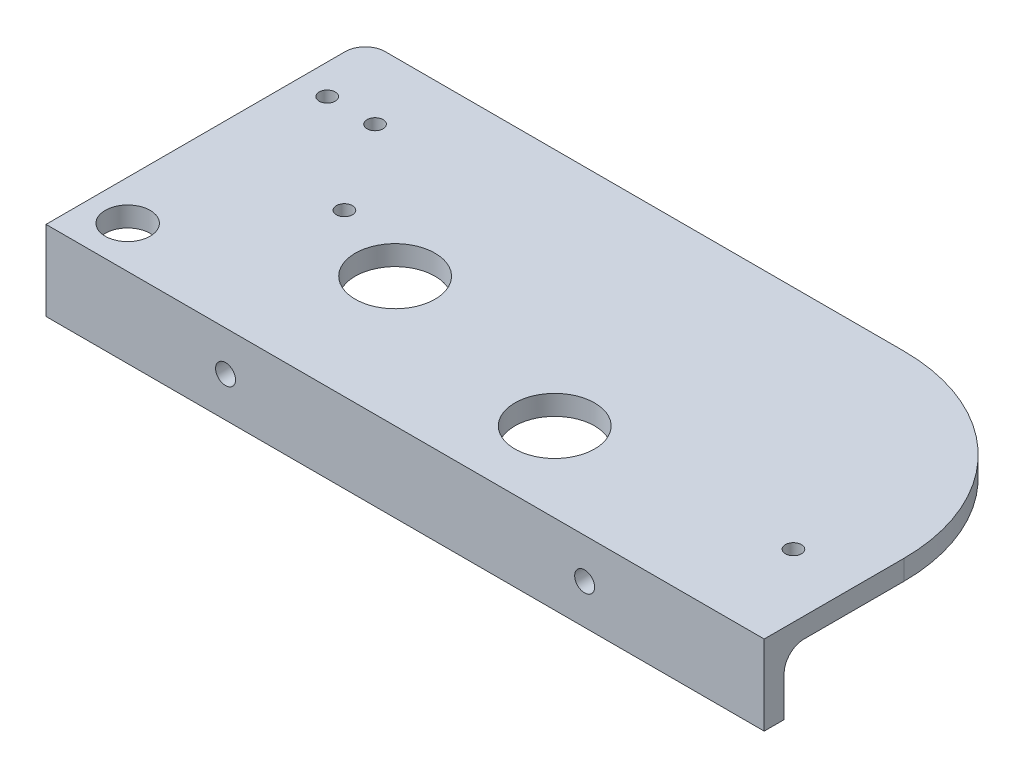
ISO-10303-21;
HEADER;
FILE_DESCRIPTION(('STEP AP214'),'2;1');
FILE_NAME('part.step','',(''),(''),'','','');
FILE_SCHEMA(('AUTOMOTIVE_DESIGN { 1 0 10303 214 1 1 1 1 }'));
ENDSEC;
DATA;
#1=APPLICATION_CONTEXT('core data for automotive mechanical design processes');
#2=APPLICATION_PROTOCOL_DEFINITION('international standard','automotive_design',2000,#1);
#3=PRODUCT_CONTEXT('',#1,'mechanical');
#4=PRODUCT('Part','Part','',(#3));
#5=PRODUCT_RELATED_PRODUCT_CATEGORY('part','',(#4));
#6=PRODUCT_DEFINITION_FORMATION('','',#4);
#7=PRODUCT_DEFINITION_CONTEXT('part definition',#1,'design');
#8=PRODUCT_DEFINITION('design','',#6,#7);
#9=PRODUCT_DEFINITION_SHAPE('','',#8);
#10=(LENGTH_UNIT() NAMED_UNIT(*) SI_UNIT(.MILLI.,.METRE.));
#11=(NAMED_UNIT(*) PLANE_ANGLE_UNIT() SI_UNIT($,.RADIAN.));
#12=(NAMED_UNIT(*) SI_UNIT($,.STERADIAN.) SOLID_ANGLE_UNIT());
#13=UNCERTAINTY_MEASURE_WITH_UNIT(LENGTH_MEASURE(1.E-05),#10,'distance_accuracy_value','');
#14=(GEOMETRIC_REPRESENTATION_CONTEXT(3) GLOBAL_UNCERTAINTY_ASSIGNED_CONTEXT((#13)) GLOBAL_UNIT_ASSIGNED_CONTEXT((#10,
#11,#12)) REPRESENTATION_CONTEXT('',''));
#15=CARTESIAN_POINT('',(0.,0.,0.));
#16=DIRECTION('',(0.,0.,1.));
#17=DIRECTION('',(1.,0.,0.));
#18=AXIS2_PLACEMENT_3D('',#15,#16,#17);
#19=CARTESIAN_POINT('',(-43.5930960469009,-19.05,45.0477144987486));
#20=DIRECTION('',(0.,0.,1.));
#21=DIRECTION('',(1.,0.,0.));
#22=AXIS2_PLACEMENT_3D('',#19,#20,#21);
#23=PLANE('',#22);
#24=DIRECTION('',(0.,1.,0.));
#25=VECTOR('',#24,1.);
#26=CARTESIAN_POINT('',(-29.2310409014925,6.35,45.0477144987486));
#27=LINE('',#26,#25);
#28=CARTESIAN_POINT('',(-29.2310409014925,-19.05,45.0477144987486));
#29=VERTEX_POINT('',#28);
#30=CARTESIAN_POINT('',(-29.2310409014925,-6.35,45.0477144987486));
#31=VERTEX_POINT('',#30);
#32=EDGE_CURVE('E165',#29,#31,#27,.T.);
#33=ORIENTED_EDGE('',*,*,#32,.T.);
#34=DIRECTION('',(1.,0.,0.));
#35=VECTOR('',#34,1.);
#36=CARTESIAN_POINT('',(185.006903953099,-6.35,45.0477144987486));
#37=LINE('',#36,#35);
#38=CARTESIAN_POINT('',(10.3819039530991,-6.35,45.0477144987486));
#39=VERTEX_POINT('',#38);
#40=EDGE_CURVE('E246',#31,#39,#37,.T.);
#41=ORIENTED_EDGE('',*,*,#40,.T.);
#42=CARTESIAN_POINT('',(13.5569039530991,-6.34999999999999,45.0477144987486));
#43=DIRECTION('',(0.,0.,1.));
#44=DIRECTION('',(1.,0.,0.));
#45=AXIS2_PLACEMENT_3D('',#42,#43,#44);
#46=CIRCLE('',#45,3.175);
#47=CARTESIAN_POINT('',(16.7319039530991,-6.35,45.0477144987486));
#48=VERTEX_POINT('',#47);
#49=EDGE_CURVE('E431',#48,#39,#46,.F.);
#50=ORIENTED_EDGE('',*,*,#49,.F.);
#51=DIRECTION('',(1.,0.,0.));
#52=VECTOR('',#51,1.);
#53=CARTESIAN_POINT('',(185.006903953099,-6.35,45.0477144987486));
#54=LINE('',#53,#52);
#55=CARTESIAN_POINT('',(124.681903953099,-6.35,45.0477144987486));
#56=VERTEX_POINT('',#55);
#57=EDGE_CURVE('E244',#48,#56,#54,.T.);
#58=ORIENTED_EDGE('',*,*,#57,.T.);
#59=CARTESIAN_POINT('',(127.856903953099,-6.34999999999998,45.0477144987486));
#60=DIRECTION('',(0.,0.,1.));
#61=DIRECTION('',(1.,0.,0.));
#62=AXIS2_PLACEMENT_3D('',#59,#60,#61);
#63=CIRCLE('',#62,3.175);
#64=CARTESIAN_POINT('',(131.031903953099,-6.35,45.0477144987486));
#65=VERTEX_POINT('',#64);
#66=EDGE_CURVE('E367',#65,#56,#63,.F.);
#67=ORIENTED_EDGE('',*,*,#66,.F.);
#68=DIRECTION('',(1.,0.,0.));
#69=VECTOR('',#68,1.);
#70=CARTESIAN_POINT('',(185.006903953099,-6.35,45.0477144987486));
#71=LINE('',#70,#69);
#72=CARTESIAN_POINT('',(185.006903953099,-6.35,45.0477144987486));
#73=VERTEX_POINT('',#72);
#74=EDGE_CURVE('E66',#65,#73,#71,.T.);
#75=ORIENTED_EDGE('',*,*,#74,.T.);
#76=DIRECTION('',(0.,1.,0.));
#77=VECTOR('',#76,1.);
#78=CARTESIAN_POINT('',(185.006903953099,-19.05,45.0477144987486));
#79=LINE('',#78,#77);
#80=CARTESIAN_POINT('',(185.006903953099,-19.05,45.0477144987486));
#81=VERTEX_POINT('',#80);
#82=EDGE_CURVE('E191',#81,#73,#79,.T.);
#83=ORIENTED_EDGE('',*,*,#82,.F.);
#84=DIRECTION('',(1.,0.,0.));
#85=VECTOR('',#84,1.);
#86=CARTESIAN_POINT('',(-43.5930960469009,-19.05,45.0477144987486));
#87=LINE('',#86,#85);
#88=EDGE_CURVE('E182',#29,#81,#87,.T.);
#89=ORIENTED_EDGE('',*,*,#88,.F.);
#90=EDGE_LOOP('',(#33,#41,#50,#58,#67,#75,#83,#89));
#91=FACE_BOUND('',#90,.T.);
#92=ADVANCED_FACE('F45',(#91),#23,.F.);
#93=CARTESIAN_POINT('',(0.,0.,0.));
#94=DIRECTION('',(0.,1.,0.));
#95=DIRECTION('',(0.,0.,1.));
#96=AXIS2_PLACEMENT_3D('',#93,#94,#95);
#97=PLANE('',#96);
#98=CARTESIAN_POINT('',(26.2569039530991,0.,10.1227144987486));
#99=DIRECTION('',(0.,-1.,0.));
#100=DIRECTION('',(0.,0.,-1.));
#101=AXIS2_PLACEMENT_3D('',#98,#99,#100);
#102=CIRCLE('',#101,12.7);
#103=CARTESIAN_POINT('',(26.2569039530991,0.,-2.5772855012514));
#104=VERTEX_POINT('',#103);
#105=EDGE_CURVE('E423',#104,#104,#102,.T.);
#106=ORIENTED_EDGE('',*,*,#105,.F.);
#107=EDGE_LOOP('',(#106));
#108=FACE_BOUND('',#107,.T.);
#109=CARTESIAN_POINT('',(-30.8930960469009,0.,38.1));
#110=DIRECTION('',(0.,1.,0.));
#111=DIRECTION('',(0.,0.,1.));
#112=AXIS2_PLACEMENT_3D('',#109,#110,#111);
#113=CIRCLE('',#112,7.14374999999999);
#114=CARTESIAN_POINT('',(-23.7743952215757,0.,38.6977144987486));
#115=VERTEX_POINT('',#114);
#116=CARTESIAN_POINT('',(-38.0117968722261,0.,38.6977144987486));
#117=VERTEX_POINT('',#116);
#118=EDGE_CURVE('E173',#115,#117,#113,.T.);
#119=ORIENTED_EDGE('',*,*,#118,.T.);
#120=DIRECTION('',(1.,0.,0.));
#121=VECTOR('',#120,1.);
#122=CARTESIAN_POINT('',(-43.5930960469009,0.,38.6977144987486));
#123=LINE('',#122,#121);
#124=CARTESIAN_POINT('',(-43.5930960469009,0.,38.6977144987486));
#125=VERTEX_POINT('',#124);
#126=EDGE_CURVE('E241',#117,#125,#123,.F.);
#127=ORIENTED_EDGE('',*,*,#126,.T.);
#128=DIRECTION('',(0.,0.,1.));
#129=VECTOR('',#128,1.);
#130=CARTESIAN_POINT('',(-43.5930960469009,0.,-50.2022855012514));
#131=LINE('',#130,#129);
#132=CARTESIAN_POINT('',(-43.5930960469009,0.,-43.8522855012514));
#133=VERTEX_POINT('',#132);
#134=EDGE_CURVE('E195',#133,#125,#131,.T.);
#135=ORIENTED_EDGE('',*,*,#134,.F.);
#136=CARTESIAN_POINT('',(-37.2430960469009,0.,-43.8522855012514));
#137=DIRECTION('',(0.,1.,0.));
#138=DIRECTION('',(0.,0.,1.));
#139=AXIS2_PLACEMENT_3D('',#136,#137,#138);
#140=CIRCLE('',#139,6.35);
#141=CARTESIAN_POINT('',(-37.2430960469009,0.,-50.2022855012514));
#142=VERTEX_POINT('',#141);
#143=EDGE_CURVE('E222',#133,#142,#140,.F.);
#144=ORIENTED_EDGE('',*,*,#143,.T.);
#145=DIRECTION('',(-1.,0.,0.));
#146=VECTOR('',#145,1.);
#147=CARTESIAN_POINT('',(-43.5930960469009,0.,-50.2022855012514));
#148=LINE('',#147,#146);
#149=CARTESIAN_POINT('',(127.856903953099,0.,-50.2022855012514));
#150=VERTEX_POINT('',#149);
#151=EDGE_CURVE('E199',#150,#142,#148,.T.);
#152=ORIENTED_EDGE('',*,*,#151,.F.);
#153=CARTESIAN_POINT('',(127.856903953099,0.,6.94771449874861));
#154=DIRECTION('',(0.,1.,0.));
#155=DIRECTION('',(0.,0.,1.));
#156=AXIS2_PLACEMENT_3D('',#153,#154,#155);
#157=CIRCLE('',#156,57.15);
#158=CARTESIAN_POINT('',(185.006903953099,0.,6.94771449874861));
#159=VERTEX_POINT('',#158);
#160=EDGE_CURVE('E224',#150,#159,#157,.F.);
#161=ORIENTED_EDGE('',*,*,#160,.T.);
#162=DIRECTION('',(0.,0.,-1.));
#163=VECTOR('',#162,1.);
#164=CARTESIAN_POINT('',(185.006903953099,0.,-50.2022855012514));
#165=LINE('',#164,#163);
#166=CARTESIAN_POINT('',(185.006903953099,0.,38.6977144987486));
#167=VERTEX_POINT('',#166);
#168=EDGE_CURVE('E210',#167,#159,#165,.T.);
#169=ORIENTED_EDGE('',*,*,#168,.F.);
#170=DIRECTION('',(1.,0.,0.));
#171=VECTOR('',#170,1.);
#172=CARTESIAN_POINT('',(-29.2310409014925,0.,38.6977144987486));
#173=LINE('',#172,#171);
#174=CARTESIAN_POINT('',(92.9319039530991,0.,38.6977144987486));
#175=VERTEX_POINT('',#174);
#176=EDGE_CURVE('E239',#167,#175,#173,.F.);
#177=ORIENTED_EDGE('',*,*,#176,.T.);
#178=CARTESIAN_POINT('',(92.9319039530991,0.,25.9977144987486));
#179=DIRECTION('',(0.,-1.,0.));
#180=DIRECTION('',(0.,0.,-1.));
#181=AXIS2_PLACEMENT_3D('',#178,#179,#180);
#182=CIRCLE('',#181,12.7);
#183=EDGE_CURVE('E418',#175,#175,#182,.T.);
#184=ORIENTED_EDGE('',*,*,#183,.F.);
#185=DIRECTION('',(1.,0.,0.));
#186=VECTOR('',#185,1.);
#187=CARTESIAN_POINT('',(-29.2310409014925,0.,38.6977144987486));
#188=LINE('',#187,#186);
#189=EDGE_CURVE('E237',#175,#115,#188,.F.);
#190=ORIENTED_EDGE('',*,*,#189,.T.);
#191=EDGE_LOOP('',(#119,#127,#135,#144,#152,#161,#169,#177,#184,#190));
#192=FACE_BOUND('',#191,.T.);
#193=CARTESIAN_POINT('',(-34.0680960469009,0.,-28.575));
#194=DIRECTION('',(0.,1.,0.));
#195=DIRECTION('',(0.,0.,1.));
#196=AXIS2_PLACEMENT_3D('',#193,#194,#195);
#197=CIRCLE('',#196,2.5527);
#198=CARTESIAN_POINT('',(-34.0680960469009,0.,-26.0223));
#199=VERTEX_POINT('',#198);
#200=EDGE_CURVE('E411',#199,#199,#197,.T.);
#201=ORIENTED_EDGE('',*,*,#200,.T.);
#202=EDGE_LOOP('',(#201));
#203=FACE_BOUND('',#202,.T.);
#204=CARTESIAN_POINT('',(-18.8280960469009,0.,-28.575));
#205=DIRECTION('',(0.,1.,0.));
#206=DIRECTION('',(0.,0.,1.));
#207=AXIS2_PLACEMENT_3D('',#204,#205,#206);
#208=CIRCLE('',#207,2.5527);
#209=CARTESIAN_POINT('',(-18.8280960469009,0.,-26.0223));
#210=VERTEX_POINT('',#209);
#211=EDGE_CURVE('E405',#210,#210,#208,.T.);
#212=ORIENTED_EDGE('',*,*,#211,.T.);
#213=EDGE_LOOP('',(#212));
#214=FACE_BOUND('',#213,.T.);
#215=CARTESIAN_POINT('',(0.,0.,0.));
#216=DIRECTION('',(0.,1.,0.));
#217=DIRECTION('',(0.,0.,1.));
#218=AXIS2_PLACEMENT_3D('',#215,#216,#217);
#219=CIRCLE('',#218,2.5527);
#220=CARTESIAN_POINT('',(0.,0.,2.5527));
#221=VERTEX_POINT('',#220);
#222=EDGE_CURVE('E397',#221,#221,#219,.T.);
#223=ORIENTED_EDGE('',*,*,#222,.T.);
#224=EDGE_LOOP('',(#223));
#225=FACE_BOUND('',#224,.T.);
#226=CARTESIAN_POINT('',(164.907701135125,0.,21.9875101453017));
#227=DIRECTION('',(0.,1.,0.));
#228=DIRECTION('',(0.,0.,1.));
#229=AXIS2_PLACEMENT_3D('',#226,#227,#228);
#230=CIRCLE('',#229,2.55269999999999);
#231=CARTESIAN_POINT('',(164.907701135125,0.,24.5402101453017));
#232=VERTEX_POINT('',#231);
#233=EDGE_CURVE('E391',#232,#232,#230,.T.);
#234=ORIENTED_EDGE('',*,*,#233,.T.);
#235=EDGE_LOOP('',(#234));
#236=FACE_BOUND('',#235,.T.);
#237=ADVANCED_FACE('F279',(#108,#192,#203,#214,#225,#236),#97,.F.);
#238=CARTESIAN_POINT('',(-43.5930960469009,6.35,-50.2022855012514));
#239=DIRECTION('',(1.,0.,0.));
#240=DIRECTION('',(0.,0.,-1.));
#241=AXIS2_PLACEMENT_3D('',#238,#239,#240);
#242=PLANE('',#241);
#243=DIRECTION('',(0.,0.,1.));
#244=VECTOR('',#243,1.);
#245=CARTESIAN_POINT('',(-43.5930960469009,6.35,-50.2022855012514));
#246=LINE('',#245,#244);
#247=CARTESIAN_POINT('',(-43.5930960469009,6.35,-43.8522855012514));
#248=VERTEX_POINT('',#247);
#249=CARTESIAN_POINT('',(-43.5930960469009,6.35,51.3977144987486));
#250=VERTEX_POINT('',#249);
#251=EDGE_CURVE('E196',#248,#250,#246,.T.);
#252=ORIENTED_EDGE('',*,*,#251,.F.);
#253=DIRECTION('',(0.,-1.,0.));
#254=VECTOR('',#253,1.);
#255=CARTESIAN_POINT('',(-43.5930960469009,6.35,-43.8522855012514));
#256=LINE('',#255,#254);
#257=EDGE_CURVE('E233',#248,#133,#256,.T.);
#258=ORIENTED_EDGE('',*,*,#257,.T.);
#259=ORIENTED_EDGE('',*,*,#134,.T.);
#260=CARTESIAN_POINT('',(-43.5930960469009,-6.35,38.6977144987486));
#261=DIRECTION('',(1.,0.,0.));
#262=DIRECTION('',(0.,0.,-1.));
#263=AXIS2_PLACEMENT_3D('',#260,#261,#262);
#264=CIRCLE('',#263,6.35);
#265=CARTESIAN_POINT('',(-43.5930960469009,-6.35,45.0477144987486));
#266=VERTEX_POINT('',#265);
#267=EDGE_CURVE('E255',#125,#266,#264,.T.);
#268=ORIENTED_EDGE('',*,*,#267,.T.);
#269=DIRECTION('',(0.,1.,0.));
#270=VECTOR('',#269,1.);
#271=CARTESIAN_POINT('',(-43.5930960469009,-19.05,45.0477144987486));
#272=LINE('',#271,#270);
#273=CARTESIAN_POINT('',(-43.5930960469009,-19.05,45.0477144987486));
#274=VERTEX_POINT('',#273);
#275=EDGE_CURVE('E193',#274,#266,#272,.T.);
#276=ORIENTED_EDGE('',*,*,#275,.F.);
#277=DIRECTION('',(0.,0.,-1.));
#278=VECTOR('',#277,1.);
#279=CARTESIAN_POINT('',(-43.5930960469009,-19.05,51.3977144987486));
#280=LINE('',#279,#278);
#281=CARTESIAN_POINT('',(-43.5930960469009,-19.05,51.3977144987486));
#282=VERTEX_POINT('',#281);
#283=EDGE_CURVE('E179',#282,#274,#280,.T.);
#284=ORIENTED_EDGE('',*,*,#283,.F.);
#285=DIRECTION('',(0.,-1.,0.));
#286=VECTOR('',#285,1.);
#287=CARTESIAN_POINT('',(-43.5930960469009,6.35,51.3977144987486));
#288=LINE('',#287,#286);
#289=EDGE_CURVE('E166',#250,#282,#288,.T.);
#290=ORIENTED_EDGE('',*,*,#289,.F.);
#291=EDGE_LOOP('',(#252,#258,#259,#268,#276,#284,#290));
#292=FACE_BOUND('',#291,.T.);
#293=ADVANCED_FACE('F275',(#292),#242,.F.);
#294=CARTESIAN_POINT('',(-43.5930960469009,6.35,51.3977144987486));
#295=DIRECTION('',(0.,0.,-1.));
#296=DIRECTION('',(-1.,0.,0.));
#297=AXIS2_PLACEMENT_3D('',#294,#295,#296);
#298=PLANE('',#297);
#299=CARTESIAN_POINT('',(127.856903953099,-6.34999999999998,51.3977144987486));
#300=DIRECTION('',(0.,0.,1.));
#301=DIRECTION('',(1.,0.,0.));
#302=AXIS2_PLACEMENT_3D('',#299,#300,#301);
#303=CIRCLE('',#302,3.175);
#304=CARTESIAN_POINT('',(131.031903953099,-6.34999999999998,51.3977144987486));
#305=VERTEX_POINT('',#304);
#306=EDGE_CURVE('E365',#305,#305,#303,.T.);
#307=ORIENTED_EDGE('',*,*,#306,.F.);
#308=EDGE_LOOP('',(#307));
#309=FACE_BOUND('',#308,.T.);
#310=CARTESIAN_POINT('',(13.5569039530991,-6.34999999999999,51.3977144987486));
#311=DIRECTION('',(0.,0.,1.));
#312=DIRECTION('',(-1.,0.,0.));
#313=AXIS2_PLACEMENT_3D('',#310,#311,#312);
#314=CIRCLE('',#313,3.175);
#315=CARTESIAN_POINT('',(10.3819039530991,-6.34999999999999,51.3977144987486));
#316=VERTEX_POINT('',#315);
#317=EDGE_CURVE('E433',#316,#316,#314,.T.);
#318=ORIENTED_EDGE('',*,*,#317,.F.);
#319=EDGE_LOOP('',(#318));
#320=FACE_BOUND('',#319,.T.);
#321=ORIENTED_EDGE('',*,*,#289,.T.);
#322=DIRECTION('',(-1.,0.,0.));
#323=VECTOR('',#322,1.);
#324=CARTESIAN_POINT('',(-43.5930960469009,-19.05,51.3977144987486));
#325=LINE('',#324,#323);
#326=CARTESIAN_POINT('',(185.006903953099,-19.05,51.3977144987486));
#327=VERTEX_POINT('',#326);
#328=EDGE_CURVE('E185',#327,#282,#325,.T.);
#329=ORIENTED_EDGE('',*,*,#328,.F.);
#330=DIRECTION('',(0.,-1.,0.));
#331=VECTOR('',#330,1.);
#332=CARTESIAN_POINT('',(185.006903953099,6.35,51.3977144987486));
#333=LINE('',#332,#331);
#334=CARTESIAN_POINT('',(185.006903953099,6.35,51.3977144987486));
#335=VERTEX_POINT('',#334);
#336=EDGE_CURVE('E207',#335,#327,#333,.T.);
#337=ORIENTED_EDGE('',*,*,#336,.F.);
#338=DIRECTION('',(1.,0.,0.));
#339=VECTOR('',#338,1.);
#340=CARTESIAN_POINT('',(-43.5930960469009,6.35,51.3977144987486));
#341=LINE('',#340,#339);
#342=EDGE_CURVE('E198',#250,#335,#341,.T.);
#343=ORIENTED_EDGE('',*,*,#342,.F.);
#344=EDGE_LOOP('',(#321,#329,#337,#343));
#345=FACE_BOUND('',#344,.T.);
#346=ADVANCED_FACE('F278',(#309,#320,#345),#298,.F.);
#347=CARTESIAN_POINT('',(185.006903953099,6.35,-50.2022855012514));
#348=DIRECTION('',(-1.,0.,0.));
#349=DIRECTION('',(0.,0.,1.));
#350=AXIS2_PLACEMENT_3D('',#347,#348,#349);
#351=PLANE('',#350);
#352=ORIENTED_EDGE('',*,*,#82,.T.);
#353=CARTESIAN_POINT('',(185.006903953099,-6.35,38.6977144987486));
#354=DIRECTION('',(-1.,0.,0.));
#355=DIRECTION('',(0.,0.,1.));
#356=AXIS2_PLACEMENT_3D('',#353,#354,#355);
#357=CIRCLE('',#356,6.35);
#358=EDGE_CURVE('E59',#73,#167,#357,.T.);
#359=ORIENTED_EDGE('',*,*,#358,.T.);
#360=ORIENTED_EDGE('',*,*,#168,.T.);
#361=DIRECTION('',(0.,-1.,0.));
#362=VECTOR('',#361,1.);
#363=CARTESIAN_POINT('',(185.006903953099,6.35,6.94771449874861));
#364=LINE('',#363,#362);
#365=CARTESIAN_POINT('',(185.006903953099,6.35,6.94771449874861));
#366=VERTEX_POINT('',#365);
#367=EDGE_CURVE('E227',#159,#366,#364,.F.);
#368=ORIENTED_EDGE('',*,*,#367,.T.);
#369=DIRECTION('',(0.,0.,-1.));
#370=VECTOR('',#369,1.);
#371=CARTESIAN_POINT('',(185.006903953099,6.35,-50.2022855012514));
#372=LINE('',#371,#370);
#373=EDGE_CURVE('E201',#335,#366,#372,.T.);
#374=ORIENTED_EDGE('',*,*,#373,.F.);
#375=ORIENTED_EDGE('',*,*,#336,.T.);
#376=DIRECTION('',(0.,0.,1.));
#377=VECTOR('',#376,1.);
#378=CARTESIAN_POINT('',(185.006903953099,-19.05,51.3977144987486));
#379=LINE('',#378,#377);
#380=EDGE_CURVE('E181',#81,#327,#379,.T.);
#381=ORIENTED_EDGE('',*,*,#380,.F.);
#382=EDGE_LOOP('',(#352,#359,#360,#368,#374,#375,#381));
#383=FACE_BOUND('',#382,.T.);
#384=ADVANCED_FACE('F283',(#383),#351,.F.);
#385=CARTESIAN_POINT('',(-43.5930960469009,6.35,-50.2022855012514));
#386=DIRECTION('',(0.,0.,1.));
#387=DIRECTION('',(1.,0.,0.));
#388=AXIS2_PLACEMENT_3D('',#385,#386,#387);
#389=PLANE('',#388);
#390=DIRECTION('',(-1.,0.,0.));
#391=VECTOR('',#390,1.);
#392=CARTESIAN_POINT('',(-43.5930960469009,6.35,-50.2022855012514));
#393=LINE('',#392,#391);
#394=CARTESIAN_POINT('',(127.856903953099,6.35,-50.2022855012514));
#395=VERTEX_POINT('',#394);
#396=CARTESIAN_POINT('',(-37.2430960469009,6.35,-50.2022855012514));
#397=VERTEX_POINT('',#396);
#398=EDGE_CURVE('E204',#395,#397,#393,.T.);
#399=ORIENTED_EDGE('',*,*,#398,.F.);
#400=DIRECTION('',(0.,-1.,0.));
#401=VECTOR('',#400,1.);
#402=CARTESIAN_POINT('',(127.856903953099,6.35,-50.2022855012514));
#403=LINE('',#402,#401);
#404=EDGE_CURVE('E219',#395,#150,#403,.T.);
#405=ORIENTED_EDGE('',*,*,#404,.T.);
#406=ORIENTED_EDGE('',*,*,#151,.T.);
#407=DIRECTION('',(0.,-1.,0.));
#408=VECTOR('',#407,1.);
#409=CARTESIAN_POINT('',(-37.2430960469009,6.35,-50.2022855012514));
#410=LINE('',#409,#408);
#411=EDGE_CURVE('E217',#142,#397,#410,.F.);
#412=ORIENTED_EDGE('',*,*,#411,.T.);
#413=EDGE_LOOP('',(#399,#405,#406,#412));
#414=FACE_BOUND('',#413,.T.);
#415=ADVANCED_FACE('F287',(#414),#389,.F.);
#416=CARTESIAN_POINT('',(0.,6.35,0.));
#417=DIRECTION('',(0.,1.,0.));
#418=DIRECTION('',(0.,0.,1.));
#419=AXIS2_PLACEMENT_3D('',#416,#417,#418);
#420=PLANE('',#419);
#421=CARTESIAN_POINT('',(-30.8930960469009,6.35,38.1));
#422=DIRECTION('',(0.,1.,0.));
#423=DIRECTION('',(0.,0.,1.));
#424=AXIS2_PLACEMENT_3D('',#421,#422,#423);
#425=CIRCLE('',#424,7.14374999999999);
#426=CARTESIAN_POINT('',(-30.8930960469009,6.35,45.24375));
#427=VERTEX_POINT('',#426);
#428=EDGE_CURVE('E174',#427,#427,#425,.T.);
#429=ORIENTED_EDGE('',*,*,#428,.F.);
#430=EDGE_LOOP('',(#429));
#431=FACE_BOUND('',#430,.T.);
#432=CARTESIAN_POINT('',(26.2569039530991,6.35,10.1227144987486));
#433=DIRECTION('',(0.,-1.,0.));
#434=DIRECTION('',(0.,0.,-1.));
#435=AXIS2_PLACEMENT_3D('',#432,#433,#434);
#436=CIRCLE('',#435,12.7);
#437=CARTESIAN_POINT('',(26.2569039530991,6.35,-2.5772855012514));
#438=VERTEX_POINT('',#437);
#439=EDGE_CURVE('E420',#438,#438,#436,.T.);
#440=ORIENTED_EDGE('',*,*,#439,.T.);
#441=EDGE_LOOP('',(#440));
#442=FACE_BOUND('',#441,.T.);
#443=CARTESIAN_POINT('',(92.9319039530991,6.35,25.9977144987486));
#444=DIRECTION('',(0.,-1.,0.));
#445=DIRECTION('',(0.,0.,-1.));
#446=AXIS2_PLACEMENT_3D('',#443,#444,#445);
#447=CIRCLE('',#446,12.7);
#448=CARTESIAN_POINT('',(92.9319039530991,6.35,13.2977144987486));
#449=VERTEX_POINT('',#448);
#450=EDGE_CURVE('E417',#449,#449,#447,.T.);
#451=ORIENTED_EDGE('',*,*,#450,.T.);
#452=EDGE_LOOP('',(#451));
#453=FACE_BOUND('',#452,.T.);
#454=CARTESIAN_POINT('',(-34.0680960469009,6.35,-28.575));
#455=DIRECTION('',(0.,1.,0.));
#456=DIRECTION('',(0.,0.,1.));
#457=AXIS2_PLACEMENT_3D('',#454,#455,#456);
#458=CIRCLE('',#457,2.5527);
#459=CARTESIAN_POINT('',(-34.0680960469009,6.35,-26.0223));
#460=VERTEX_POINT('',#459);
#461=EDGE_CURVE('E414',#460,#460,#458,.T.);
#462=ORIENTED_EDGE('',*,*,#461,.F.);
#463=EDGE_LOOP('',(#462));
#464=FACE_BOUND('',#463,.T.);
#465=CARTESIAN_POINT('',(-18.8280960469009,6.35,-28.575));
#466=DIRECTION('',(0.,1.,0.));
#467=DIRECTION('',(0.,0.,1.));
#468=AXIS2_PLACEMENT_3D('',#465,#466,#467);
#469=CIRCLE('',#468,2.5527);
#470=CARTESIAN_POINT('',(-18.8280960469009,6.35,-26.0223));
#471=VERTEX_POINT('',#470);
#472=EDGE_CURVE('E408',#471,#471,#469,.T.);
#473=ORIENTED_EDGE('',*,*,#472,.F.);
#474=EDGE_LOOP('',(#473));
#475=FACE_BOUND('',#474,.T.);
#476=CARTESIAN_POINT('',(0.,6.35,0.));
#477=DIRECTION('',(0.,1.,0.));
#478=DIRECTION('',(0.,0.,1.));
#479=AXIS2_PLACEMENT_3D('',#476,#477,#478);
#480=CIRCLE('',#479,2.5527);
#481=CARTESIAN_POINT('',(0.,6.35,2.5527));
#482=VERTEX_POINT('',#481);
#483=EDGE_CURVE('E402',#482,#482,#480,.T.);
#484=ORIENTED_EDGE('',*,*,#483,.F.);
#485=EDGE_LOOP('',(#484));
#486=FACE_BOUND('',#485,.T.);
#487=CARTESIAN_POINT('',(164.907701135125,6.35,21.9875101453017));
#488=DIRECTION('',(0.,1.,0.));
#489=DIRECTION('',(0.,0.,1.));
#490=AXIS2_PLACEMENT_3D('',#487,#488,#489);
#491=CIRCLE('',#490,2.55269999999999);
#492=CARTESIAN_POINT('',(164.907701135125,6.35,24.5402101453017));
#493=VERTEX_POINT('',#492);
#494=EDGE_CURVE('E393',#493,#493,#491,.T.);
#495=ORIENTED_EDGE('',*,*,#494,.F.);
#496=EDGE_LOOP('',(#495));
#497=FACE_BOUND('',#496,.T.);
#498=ORIENTED_EDGE('',*,*,#373,.T.);
#499=CARTESIAN_POINT('',(127.856903953099,6.35,6.94771449874861));
#500=DIRECTION('',(0.,1.,0.));
#501=DIRECTION('',(0.,0.,1.));
#502=AXIS2_PLACEMENT_3D('',#499,#500,#501);
#503=CIRCLE('',#502,57.15);
#504=EDGE_CURVE('E231',#366,#395,#503,.T.);
#505=ORIENTED_EDGE('',*,*,#504,.T.);
#506=ORIENTED_EDGE('',*,*,#398,.T.);
#507=CARTESIAN_POINT('',(-37.2430960469009,6.35,-43.8522855012514));
#508=DIRECTION('',(0.,1.,0.));
#509=DIRECTION('',(0.,0.,1.));
#510=AXIS2_PLACEMENT_3D('',#507,#508,#509);
#511=CIRCLE('',#510,6.35);
#512=EDGE_CURVE('E229',#397,#248,#511,.T.);
#513=ORIENTED_EDGE('',*,*,#512,.T.);
#514=ORIENTED_EDGE('',*,*,#251,.T.);
#515=ORIENTED_EDGE('',*,*,#342,.T.);
#516=EDGE_LOOP('',(#498,#505,#506,#513,#514,#515));
#517=FACE_BOUND('',#516,.T.);
#518=ADVANCED_FACE('F291',(#431,#442,#453,#464,#475,#486,#497,#517),#420,.T.);
#519=ORIENTED_EDGE('',*,*,#275,.T.);
#520=DIRECTION('',(1.,0.,0.));
#521=VECTOR('',#520,1.);
#522=CARTESIAN_POINT('',(-32.5551511923092,-6.35,45.0477144987486));
#523=LINE('',#522,#521);
#524=CARTESIAN_POINT('',(-32.5551511923092,-6.35,45.0477144987486));
#525=VERTEX_POINT('',#524);
#526=EDGE_CURVE('E164',#266,#525,#523,.T.);
#527=ORIENTED_EDGE('',*,*,#526,.T.);
#528=DIRECTION('',(0.,1.,0.));
#529=VECTOR('',#528,1.);
#530=CARTESIAN_POINT('',(-32.5551511923092,6.35,45.0477144987486));
#531=LINE('',#530,#529);
#532=CARTESIAN_POINT('',(-32.5551511923092,-19.05,45.0477144987486));
#533=VERTEX_POINT('',#532);
#534=EDGE_CURVE('E156',#525,#533,#531,.F.);
#535=ORIENTED_EDGE('',*,*,#534,.T.);
#536=EDGE_CURVE('E161',#274,#533,#87,.T.);
#537=ORIENTED_EDGE('',*,*,#536,.F.);
#538=EDGE_LOOP('',(#519,#527,#535,#537));
#539=FACE_BOUND('',#538,.T.);
#540=ADVANCED_FACE('F159',(#539),#23,.F.);
#541=CARTESIAN_POINT('',(0.,-19.05,0.));
#542=DIRECTION('',(0.,-1.,0.));
#543=DIRECTION('',(0.,0.,-1.));
#544=AXIS2_PLACEMENT_3D('',#541,#542,#543);
#545=PLANE('',#544);
#546=CARTESIAN_POINT('',(-30.8930960469009,-19.05,38.1));
#547=DIRECTION('',(0.,1.,0.));
#548=DIRECTION('',(0.,0.,1.));
#549=AXIS2_PLACEMENT_3D('',#546,#547,#548);
#550=CIRCLE('',#549,7.14374999999999);
#551=EDGE_CURVE('E169',#533,#29,#550,.T.);
#552=ORIENTED_EDGE('',*,*,#551,.T.);
#553=ORIENTED_EDGE('',*,*,#88,.T.);
#554=ORIENTED_EDGE('',*,*,#380,.T.);
#555=ORIENTED_EDGE('',*,*,#328,.T.);
#556=ORIENTED_EDGE('',*,*,#283,.T.);
#557=ORIENTED_EDGE('',*,*,#536,.T.);
#558=EDGE_LOOP('',(#552,#553,#554,#555,#556,#557));
#559=FACE_BOUND('',#558,.T.);
#560=ADVANCED_FACE('F176',(#559),#545,.T.);
#561=CARTESIAN_POINT('',(164.907701135125,6.35,21.9875101453017));
#562=DIRECTION('',(0.,1.,0.));
#563=DIRECTION('',(0.,0.,1.));
#564=AXIS2_PLACEMENT_3D('',#561,#562,#563);
#565=CYLINDRICAL_SURFACE('',#564,2.55269999999999);
#566=ORIENTED_EDGE('',*,*,#494,.T.);
#567=EDGE_LOOP('',(#566));
#568=FACE_BOUND('',#567,.T.);
#569=ORIENTED_EDGE('',*,*,#233,.F.);
#570=EDGE_LOOP('',(#569));
#571=FACE_BOUND('',#570,.T.);
#572=ADVANCED_FACE('F303',(#568,#571),#565,.F.);
#573=CARTESIAN_POINT('',(0.,6.35,0.));
#574=DIRECTION('',(0.,1.,0.));
#575=DIRECTION('',(0.,0.,1.));
#576=AXIS2_PLACEMENT_3D('',#573,#574,#575);
#577=CYLINDRICAL_SURFACE('',#576,2.5527);
#578=ORIENTED_EDGE('',*,*,#483,.T.);
#579=EDGE_LOOP('',(#578));
#580=FACE_BOUND('',#579,.T.);
#581=ORIENTED_EDGE('',*,*,#222,.F.);
#582=EDGE_LOOP('',(#581));
#583=FACE_BOUND('',#582,.T.);
#584=ADVANCED_FACE('F306',(#580,#583),#577,.F.);
#585=CARTESIAN_POINT('',(-18.8280960469009,6.35,-28.575));
#586=DIRECTION('',(0.,1.,0.));
#587=DIRECTION('',(0.,0.,1.));
#588=AXIS2_PLACEMENT_3D('',#585,#586,#587);
#589=CYLINDRICAL_SURFACE('',#588,2.5527);
#590=ORIENTED_EDGE('',*,*,#472,.T.);
#591=EDGE_LOOP('',(#590));
#592=FACE_BOUND('',#591,.T.);
#593=ORIENTED_EDGE('',*,*,#211,.F.);
#594=EDGE_LOOP('',(#593));
#595=FACE_BOUND('',#594,.T.);
#596=ADVANCED_FACE('F310',(#592,#595),#589,.F.);
#597=CARTESIAN_POINT('',(-34.0680960469009,6.35,-28.575));
#598=DIRECTION('',(0.,1.,0.));
#599=DIRECTION('',(0.,0.,1.));
#600=AXIS2_PLACEMENT_3D('',#597,#598,#599);
#601=CYLINDRICAL_SURFACE('',#600,2.5527);
#602=ORIENTED_EDGE('',*,*,#461,.T.);
#603=EDGE_LOOP('',(#602));
#604=FACE_BOUND('',#603,.T.);
#605=ORIENTED_EDGE('',*,*,#200,.F.);
#606=EDGE_LOOP('',(#605));
#607=FACE_BOUND('',#606,.T.);
#608=ADVANCED_FACE('F314',(#604,#607),#601,.F.);
#609=CARTESIAN_POINT('',(92.9319039530991,6.35,25.9977144987486));
#610=DIRECTION('',(0.,-1.,0.));
#611=DIRECTION('',(0.,0.,-1.));
#612=AXIS2_PLACEMENT_3D('',#609,#610,#611);
#613=CYLINDRICAL_SURFACE('',#612,12.7);
#614=ORIENTED_EDGE('',*,*,#450,.F.);
#615=EDGE_LOOP('',(#614));
#616=FACE_BOUND('',#615,.T.);
#617=ORIENTED_EDGE('',*,*,#183,.T.);
#618=EDGE_LOOP('',(#617));
#619=FACE_BOUND('',#618,.T.);
#620=ADVANCED_FACE('F318',(#616,#619),#613,.F.);
#621=CARTESIAN_POINT('',(26.2569039530991,6.35,10.1227144987486));
#622=DIRECTION('',(0.,-1.,0.));
#623=DIRECTION('',(0.,0.,-1.));
#624=AXIS2_PLACEMENT_3D('',#621,#622,#623);
#625=CYLINDRICAL_SURFACE('',#624,12.7);
#626=ORIENTED_EDGE('',*,*,#439,.F.);
#627=EDGE_LOOP('',(#626));
#628=FACE_BOUND('',#627,.T.);
#629=ORIENTED_EDGE('',*,*,#105,.T.);
#630=EDGE_LOOP('',(#629));
#631=FACE_BOUND('',#630,.T.);
#632=ADVANCED_FACE('F321',(#628,#631),#625,.F.);
#633=CARTESIAN_POINT('',(-30.8930960469009,6.35,38.1));
#634=DIRECTION('',(0.,1.,0.));
#635=DIRECTION('',(0.,0.,1.));
#636=AXIS2_PLACEMENT_3D('',#633,#634,#635);
#637=CYLINDRICAL_SURFACE('',#636,7.14374999999999);
#638=ORIENTED_EDGE('',*,*,#428,.T.);
#639=EDGE_LOOP('',(#638));
#640=FACE_BOUND('',#639,.T.);
#641=ORIENTED_EDGE('',*,*,#551,.F.);
#642=ORIENTED_EDGE('',*,*,#534,.F.);
#643=CARTESIAN_POINT('',(-32.5551511923092,-6.35,45.0477144987486));
#644=CARTESIAN_POINT('',(-32.5551004299207,-6.29810024521764,45.0477209639409));
#645=CARTESIAN_POINT('',(-32.5578120257045,-6.24625435279636,45.0470780970673));
#646=CARTESIAN_POINT('',(-32.5683179441787,-6.14326105761598,45.0445550363938));
#647=CARTESIAN_POINT('',(-32.5760970257533,-6.0921120283939,45.0426785527002));
#648=CARTESIAN_POINT('',(-32.6059678662778,-5.94230527101519,45.0353902068767));
#649=CARTESIAN_POINT('',(-32.6346324151875,-5.84502459946606,45.0283135611741));
#650=CARTESIAN_POINT('',(-32.6982236599863,-5.67280100706936,45.011985476607));
#651=CARTESIAN_POINT('',(-32.731099535745,-5.59698529268635,45.0033533318993));
#652=CARTESIAN_POINT('',(-32.8028698455909,-5.44851786559951,44.9838444129889));
#653=CARTESIAN_POINT('',(-32.841768818979,-5.37586859264017,44.9729659437662));
#654=CARTESIAN_POINT('',(-32.9243257668875,-5.23242173508507,44.9490249008474));
#655=CARTESIAN_POINT('',(-32.9680405046534,-5.16166198484969,44.9359350250333));
#656=CARTESIAN_POINT('',(-33.0585025138825,-5.02255731092954,44.9078210675296));
#657=CARTESIAN_POINT('',(-33.1052488791178,-4.95421167495685,44.8927975625392));
#658=CARTESIAN_POINT('',(-33.2288699120141,-4.78008625549697,44.8515692730684));
#659=CARTESIAN_POINT('',(-33.30737220885,-4.67579648003662,44.823964768705));
#660=CARTESIAN_POINT('',(-33.4675662507024,-4.47099754562117,44.7642788046666));
#661=CARTESIAN_POINT('',(-33.5492593468949,-4.37049002445992,44.7321954332373));
#662=CARTESIAN_POINT('',(-33.7972457963681,-4.07325211063147,44.6292442871791));
#663=CARTESIAN_POINT('',(-33.9662588696681,-3.88105563443345,44.5517359007772));
#664=CARTESIAN_POINT('',(-34.3050611814848,-3.50641679874424,44.3791623816747));
#665=CARTESIAN_POINT('',(-34.4748477995236,-3.32395335877045,44.2841373590613));
#666=CARTESIAN_POINT('',(-34.8122690181801,-2.96782448067754,44.0759935851062));
#667=CARTESIAN_POINT('',(-34.9799052847117,-2.794151880879,43.962889884876));
#668=CARTESIAN_POINT('',(-35.2887455456843,-2.47832105204549,43.7341221259257));
#669=CARTESIAN_POINT('',(-35.4305122506391,-2.33503338847388,43.6207766578672));
#670=CARTESIAN_POINT('',(-35.7091509985744,-2.05608211651871,43.3794656362505));
#671=CARTESIAN_POINT('',(-35.8460220116828,-1.9204201089,43.2514970300004));
#672=CARTESIAN_POINT('',(-36.1130607920919,-1.65809130548495,42.9806986911463));
#673=CARTESIAN_POINT('',(-36.2432378844519,-1.53141189762443,42.837890518214));
#674=CARTESIAN_POINT('',(-36.4953071883968,-1.28839630425699,42.5370002429247));
#675=CARTESIAN_POINT('',(-36.6171989759894,-1.1720606479875,42.3789173599006));
#676=CARTESIAN_POINT('',(-36.9033105978291,-0.901968514451368,41.9725624221827));
#677=CARTESIAN_POINT('',(-37.0619604866804,-0.754865203145763,41.7156664324758));
#678=CARTESIAN_POINT('',(-37.2780926657726,-0.55916632729869,41.3075966266378));
#679=CARTESIAN_POINT('',(-37.3464384020892,-0.498141662938218,41.1679377819047));
#680=CARTESIAN_POINT('',(-37.4750197213212,-0.385287884305501,40.8813780603656));
#681=CARTESIAN_POINT('',(-37.5352590645501,-0.33345450290196,40.734480584848));
#682=CARTESIAN_POINT('',(-37.645369358921,-0.241084906613401,40.437616095544));
#683=CARTESIAN_POINT('',(-37.6954487342323,-0.20031414317449,40.2877997540047));
#684=CARTESIAN_POINT('',(-37.7860783182784,-0.129442654958665,39.9828828206501));
#685=CARTESIAN_POINT('',(-37.8266311076014,-0.0993390395090905,39.8277836729207));
#686=CARTESIAN_POINT('',(-37.8978581539092,-0.0503403782632417,39.5117275774242));
#687=CARTESIAN_POINT('',(-37.9284200784423,-0.0315709043026377,39.3507252441967));
#688=CARTESIAN_POINT('',(-37.9659690257568,-0.0126901631192803,39.107177642769));
#689=CARTESIAN_POINT('',(-37.977108311586,-0.00794208728612965,39.0255917742227));
#690=CARTESIAN_POINT('',(-37.9965728293008,-0.00159609825926106,38.8619540146337));
#691=CARTESIAN_POINT('',(-38.0048977406681,1.45623391515105E-06,38.7799020715927));
#692=CARTESIAN_POINT('',(-38.0117968722261,0.,38.6977144987486));
#693=B_SPLINE_CURVE_WITH_KNOTS('',3,(#643,#644,#645,#646,#647,#648,#649,#650,#651,#652,#653,
#654,#655,#656,#657,#658,#659,#660,#661,#662,#663,#664,#665,#666,#667,#668,#669,#670,#671,#672,
#673,#674,#675,#676,#677,#678,#679,#680,#681,#682,#683,#684,#685,#686,#687,#688,#689,#690,#691,
#692),.UNSPECIFIED.,.F.,.F.,(4,2,2,2,2,2,2,2,2,2,2,2,2,2,2,2,2,2,2,2,2,2,2,2,4),(0.,
0.155532980793016,0.3106003225479,0.614061245472322,0.862992546645762,1.11211237605429,
1.36456889168719,1.6169502866411,2.01697123143923,2.41716344574999,3.21849764082508,
4.01801921149788,4.81687858746965,5.51004472795571,6.20335583744447,6.89567339134364,
7.58802634726846,8.59126364329447,9.09187488701183,9.59225310571695,10.0810026759904,
10.5696196993613,11.0635553100349,11.3108985648339,11.5582699791117),.UNSPECIFIED.);
#694=EDGE_CURVE('E249',#525,#117,#693,.T.);
#695=ORIENTED_EDGE('',*,*,#694,.T.);
#696=ORIENTED_EDGE('',*,*,#118,.F.);
#697=CARTESIAN_POINT('',(-23.7743952215757,0.,38.6977144987486));
#698=CARTESIAN_POINT('',(-23.787146333677,3.68137982431913E-05,38.8500453676331));
#699=CARTESIAN_POINT('',(-23.8048595360115,-0.00547949787110387,39.0019201450206));
#700=CARTESIAN_POINT('',(-23.8497897750334,-0.0271532743415285,39.3033482787244));
#701=CARTESIAN_POINT('',(-23.8769978352697,-0.0433007012114366,39.4529036887841));
#702=CARTESIAN_POINT('',(-23.9402512799854,-0.0855915931351198,39.7473111701237));
#703=CARTESIAN_POINT('',(-23.9762190719935,-0.111648362649146,39.8921925323079));
#704=CARTESIAN_POINT('',(-24.0565226809202,-0.173126976870377,40.1775955717703));
#705=CARTESIAN_POINT('',(-24.1008601208309,-0.208550638484235,40.3181163973151));
#706=CARTESIAN_POINT('',(-24.1970422535042,-0.287888480857732,40.5934329247356));
#707=CARTESIAN_POINT('',(-24.248857242308,-0.33176928745002,40.7282486705065));
#708=CARTESIAN_POINT('',(-24.3594080882221,-0.42735309793194,40.992159148863));
#709=CARTESIAN_POINT('',(-24.4181464708582,-0.479058958221508,41.121251769981));
#710=CARTESIAN_POINT('',(-24.6038898697767,-0.644982544125215,41.4997050162548));
#711=CARTESIAN_POINT('',(-24.7403053598694,-0.769908370554445,41.7399111420991));
#712=CARTESIAN_POINT('',(-24.9927099364825,-1.00536163625251,42.1320416710904));
#713=CARTESIAN_POINT('',(-25.1041884514578,-1.11058882981441,42.2902277621167));
#714=CARTESIAN_POINT('',(-25.3356270299678,-1.33133693399001,42.5926515995891));
#715=CARTESIAN_POINT('',(-25.455588121193,-1.44685909231355,42.736887650915));
#716=CARTESIAN_POINT('',(-25.7026670203804,-1.68699404125578,43.0119139899104));
#717=CARTESIAN_POINT('',(-25.8298042597362,-1.81163181374781,43.1426647654597));
#718=CARTESIAN_POINT('',(-26.0894396455873,-2.06848805262697,43.3905820478541));
#719=CARTESIAN_POINT('',(-26.2219370810245,-2.20070551449291,43.5077503485661));
#720=CARTESIAN_POINT('',(-26.5336940567432,-2.51490595270906,43.7640463844423));
#721=CARTESIAN_POINT('',(-26.7144445431817,-2.6993616342607,43.8983357112498));
#722=CARTESIAN_POINT('',(-27.0800736109551,-3.07886105479422,44.1450507897509));
#723=CARTESIAN_POINT('',(-27.2649557330238,-3.27391409773155,44.2574569189863));
#724=CARTESIAN_POINT('',(-27.5421598446713,-3.57414588690868,44.4099524082549));
#725=CARTESIAN_POINT('',(-27.6344344736144,-3.67537675880149,44.4580521596611));
#726=CARTESIAN_POINT('',(-27.8183722003557,-3.88070107846369,44.5490117264941));
#727=CARTESIAN_POINT('',(-27.910035367712,-3.98479419348633,44.5918721478848));
#728=CARTESIAN_POINT('',(-28.0917588204888,-4.19611228021621,44.6723307419289));
#729=CARTESIAN_POINT('',(-28.1818210079423,-4.30333307129655,44.7099355820156));
#730=CARTESIAN_POINT('',(-28.3591105395145,-4.52172483368945,44.7799063305007));
#731=CARTESIAN_POINT('',(-28.4463388020012,-4.63289450037345,44.8122739498953));
#732=CARTESIAN_POINT('',(-28.620439403999,-4.86660612146793,44.8732668620253));
#733=CARTESIAN_POINT('',(-28.7070318403224,-4.9894375547575,44.9015910152551));
#734=CARTESIAN_POINT('',(-28.8700631595934,-5.24313374271178,44.9518392497386));
#735=CARTESIAN_POINT('',(-28.9465085936099,-5.37399323373933,44.9737674713689));
#736=CARTESIAN_POINT('',(-29.0591107341363,-5.60429638721909,45.0044890216981));
#737=CARTESIAN_POINT('',(-29.1004093919467,-5.70089533947898,45.0152467902674));
#738=CARTESIAN_POINT('',(-29.1682190709295,-5.89933868998544,45.0324751186464));
#739=CARTESIAN_POINT('',(-29.1948061089587,-6.00115309630475,45.038967750222));
#740=CARTESIAN_POINT('',(-29.2178036963776,-6.14508177163783,45.0445374528998));
#741=CARTESIAN_POINT('',(-29.2227315747545,-6.18580626077569,45.0457227125496));
#742=CARTESIAN_POINT('',(-29.2293639988181,-6.26767847848618,45.047313550336));
#743=CARTESIAN_POINT('',(-29.2310568218176,-6.30882720510723,45.0477162929976));
#744=CARTESIAN_POINT('',(-29.2310409014925,-6.35,45.0477144987486));
#745=B_SPLINE_CURVE_WITH_KNOTS('',3,(#697,#698,#699,#700,#701,#702,#703,#704,#705,#706,#707,
#708,#709,#710,#711,#712,#713,#714,#715,#716,#717,#718,#719,#720,#721,#722,#723,#724,#725,#726,
#727,#728,#729,#730,#731,#732,#733,#734,#735,#736,#737,#738,#739,#740,#741,#742,#743,#744),
.UNSPECIFIED.,.F.,.F.,(4,2,2,2,2,2,2,2,2,2,2,2,2,2,2,2,2,2,2,2,2,2,2,4),(0.,0.458351026481748,
0.916269896004292,1.37027137503365,1.82436098192522,2.27669402251437,2.72919257947587,
3.63526960573666,4.29533240764904,4.95547531569158,5.61750056267779,6.27943827469398,
7.15153151337041,8.02440318397239,8.45983068471202,8.89520777758133,9.33002742068873,
9.7647047204498,10.2231342383372,10.6812663319985,10.9973036057239,11.311692249789,
11.4346860156481,11.5581246281811),.UNSPECIFIED.);
#746=EDGE_CURVE('E12',#115,#31,#745,.T.);
#747=ORIENTED_EDGE('',*,*,#746,.T.);
#748=ORIENTED_EDGE('',*,*,#32,.F.);
#749=EDGE_LOOP('',(#641,#642,#695,#696,#747,#748));
#750=FACE_BOUND('',#749,.T.);
#751=ADVANCED_FACE('F170',(#640,#750),#637,.F.);
#752=CARTESIAN_POINT('',(127.856903953099,6.35,6.94771449874861));
#753=DIRECTION('',(0.,-1.,0.));
#754=DIRECTION('',(0.,0.,-1.));
#755=AXIS2_PLACEMENT_3D('',#752,#753,#754);
#756=CYLINDRICAL_SURFACE('',#755,57.15);
#757=ORIENTED_EDGE('',*,*,#504,.F.);
#758=ORIENTED_EDGE('',*,*,#367,.F.);
#759=ORIENTED_EDGE('',*,*,#160,.F.);
#760=ORIENTED_EDGE('',*,*,#404,.F.);
#761=EDGE_LOOP('',(#757,#758,#759,#760));
#762=FACE_BOUND('',#761,.T.);
#763=ADVANCED_FACE('F270',(#762),#756,.T.);
#764=CARTESIAN_POINT('',(-37.2430960469009,6.35,-43.8522855012514));
#765=DIRECTION('',(0.,-1.,0.));
#766=DIRECTION('',(0.,0.,-1.));
#767=AXIS2_PLACEMENT_3D('',#764,#765,#766);
#768=CYLINDRICAL_SURFACE('',#767,6.35);
#769=ORIENTED_EDGE('',*,*,#512,.F.);
#770=ORIENTED_EDGE('',*,*,#411,.F.);
#771=ORIENTED_EDGE('',*,*,#143,.F.);
#772=ORIENTED_EDGE('',*,*,#257,.F.);
#773=EDGE_LOOP('',(#769,#770,#771,#772));
#774=FACE_BOUND('',#773,.T.);
#775=ADVANCED_FACE('F266',(#774),#768,.T.);
#776=CARTESIAN_POINT('',(13.5569039530991,-6.34999999999999,-50.2032855012514));
#777=DIRECTION('',(0.,0.,1.));
#778=DIRECTION('',(1.,0.,0.));
#779=AXIS2_PLACEMENT_3D('',#776,#777,#778);
#780=CYLINDRICAL_SURFACE('',#779,3.175);
#781=ORIENTED_EDGE('',*,*,#317,.T.);
#782=EDGE_LOOP('',(#781));
#783=FACE_BOUND('',#782,.T.);
#784=ORIENTED_EDGE('',*,*,#49,.T.);
#785=CARTESIAN_POINT('',(10.3819039530991,-6.35,45.0477144987486));
#786=CARTESIAN_POINT('',(10.3818904888953,-6.26618686410692,45.0477293755838));
#787=CARTESIAN_POINT('',(10.385222302879,-6.18238326797719,45.0460555297341));
#788=CARTESIAN_POINT('',(10.3984719046367,-6.01546079915987,45.0394420042332));
#789=CARTESIAN_POINT('',(10.4083870475978,-5.93234166506447,45.0345036360876));
#790=CARTESIAN_POINT('',(10.4346395167979,-5.76775760311678,45.0215019112873));
#791=CARTESIAN_POINT('',(10.450947663141,-5.6862869034774,45.013452755677));
#792=CARTESIAN_POINT('',(10.4897854679397,-5.52520786576565,44.9944443658534));
#793=CARTESIAN_POINT('',(10.5123155117709,-5.44559964338391,44.9834849513844));
#794=CARTESIAN_POINT('',(10.5888449744246,-5.21056327425296,44.9466517133709));
#795=CARTESIAN_POINT('',(10.6518399002075,-5.05857769877758,44.9167939318795));
#796=CARTESIAN_POINT('',(10.7995541567832,-4.7674756130362,44.8491819664757));
#797=CARTESIAN_POINT('',(10.884295198619,-4.62837215409356,44.81141989801));
#798=CARTESIAN_POINT('',(11.0788771293849,-4.35766168926919,44.7288236737504));
#799=CARTESIAN_POINT('',(11.1899186419565,-4.22700475803649,44.683701187124));
#800=CARTESIAN_POINT('',(11.4313146378243,-3.98531507255811,44.5924149430305));
#801=CARTESIAN_POINT('',(11.561681712521,-3.87429521688877,44.546250523451));
#802=CARTESIAN_POINT('',(11.850326544026,-3.66631102678416,44.4539503142253));
#803=CARTESIAN_POINT('',(12.0099852740317,-3.57110652069812,44.4080948718239));
#804=CARTESIAN_POINT('',(12.2614570681778,-3.44980417727816,44.3469109270934));
#805=CARTESIAN_POINT('',(12.3473081894241,-3.41294563641814,44.3277778243472));
#806=CARTESIAN_POINT('',(12.5224917269107,-3.34677422203383,44.2927601633908));
#807=CARTESIAN_POINT('',(12.6118220492338,-3.31745688831455,44.2768736861343));
#808=CARTESIAN_POINT('',(12.7879135322798,-3.26825763434673,44.2498407643382));
#809=CARTESIAN_POINT('',(12.874512771629,-3.24791918170214,44.2384690494568));
#810=CARTESIAN_POINT('',(13.0494872261428,-3.21454467452639,44.2196514315942));
#811=CARTESIAN_POINT('',(13.1378614733665,-3.20150474628521,44.2122034462073));
#812=CARTESIAN_POINT('',(13.31560561571,-3.18292322788359,44.2015534635416));
#813=CARTESIAN_POINT('',(13.40497490338,-3.17737729140455,44.19834900515));
#814=CARTESIAN_POINT('',(13.5838826989544,-3.17385216469908,44.1963123559608));
#815=CARTESIAN_POINT('',(13.6734211899007,-3.17587225261346,44.1974797480538));
#816=CARTESIAN_POINT('',(13.9196535309632,-3.19188081551779,44.2067064673829));
#817=CARTESIAN_POINT('',(14.07574907771,-3.21378798193145,44.2193233522091));
#818=CARTESIAN_POINT('',(14.3815538330503,-3.2799634560278,44.2563799539466));
#819=CARTESIAN_POINT('',(14.5312611310395,-3.32423840335697,44.2808231812952));
#820=CARTESIAN_POINT('',(14.8244462430896,-3.4346842829461,44.3392929587349));
#821=CARTESIAN_POINT('',(14.9676977692,-3.50134115452813,44.3735294448087));
#822=CARTESIAN_POINT('',(15.2416662559721,-3.65428941796553,44.4477460264873));
#823=CARTESIAN_POINT('',(15.3723771992783,-3.74059016923852,44.4877288566063));
#824=CARTESIAN_POINT('',(15.6350046519636,-3.94313949796677,44.5750561950228));
#825=CARTESIAN_POINT('',(15.7649741268789,-4.06179746577004,44.6226914584833));
#826=CARTESIAN_POINT('',(16.0039795382506,-4.31939274356096,44.7158477714804));
#827=CARTESIAN_POINT('',(16.113004172226,-4.45834093199382,44.761367669513));
#828=CARTESIAN_POINT('',(16.3118684167099,-4.76097644550847,44.8477785773501));
#829=CARTESIAN_POINT('',(16.4005674055417,-4.9255188149455,44.8883520538987));
#830=CARTESIAN_POINT('',(16.5112841306166,-5.18336443855662,44.9402460818024));
#831=CARTESIAN_POINT('',(16.5444623559155,-5.27112882962959,44.9560469556014));
#832=CARTESIAN_POINT('',(16.6030427488004,-5.44973041654207,44.9842216935998));
#833=CARTESIAN_POINT('',(16.6284478699252,-5.5405664306542,44.9965968592914));
#834=CARTESIAN_POINT('',(16.6769192559136,-5.74956064843138,45.0203564434783));
#835=CARTESIAN_POINT('',(16.6974861430282,-5.8684523903165,45.0305636347586));
#836=CARTESIAN_POINT('',(16.71810695105,-6.04821512211847,45.0408248887671));
#837=CARTESIAN_POINT('',(16.7232756573805,-6.10840830117201,45.0434037455141));
#838=CARTESIAN_POINT('',(16.7301751202464,-6.22906133844421,45.0468498565199));
#839=CARTESIAN_POINT('',(16.7319046645024,-6.28952128317224,45.047716507238));
#840=CARTESIAN_POINT('',(16.7319039530991,-6.35,45.0477144987486));
#841=B_SPLINE_CURVE_WITH_KNOTS('',3,(#785,#786,#787,#788,#789,#790,#791,#792,#793,#794,#795,
#796,#797,#798,#799,#800,#801,#802,#803,#804,#805,#806,#807,#808,#809,#810,#811,#812,#813,#814,
#815,#816,#817,#818,#819,#820,#821,#822,#823,#824,#825,#826,#827,#828,#829,#830,#831,#832,#833,
#834,#835,#836,#837,#838,#839,#840),.UNSPECIFIED.,.F.,.F.,(4,2,2,2,2,2,2,2,2,2,2,2,2,2,2,2,2,2,
2,2,2,2,2,2,2,2,2,4),(0.,0.251340642456383,0.502580371369125,0.752686462215378,1.00280804775646,
1.5020101843342,2.00171267021975,2.53138728506782,3.06140853403427,3.63256934148912,
3.91833589745097,4.20393304810651,4.47258918308845,4.7411025926135,5.009460204468,
5.27779221351351,5.74974058996722,6.22182914184532,6.70491257972051,7.18822666852087,
7.73279923072408,8.27766484063191,8.84810377097813,9.13318372784542,9.4181552282588,
9.78034993987073,9.9616542880735,10.1430225334118),.UNSPECIFIED.);
#842=EDGE_CURVE('E340',#39,#48,#841,.T.);
#843=ORIENTED_EDGE('',*,*,#842,.T.);
#844=EDGE_LOOP('',(#784,#843));
#845=FACE_BOUND('',#844,.T.);
#846=ADVANCED_FACE('F269',(#783,#845),#780,.F.);
#847=CARTESIAN_POINT('',(127.856903953099,-6.34999999999998,-50.2032855012514));
#848=DIRECTION('',(0.,0.,1.));
#849=DIRECTION('',(1.,0.,0.));
#850=AXIS2_PLACEMENT_3D('',#847,#848,#849);
#851=CYLINDRICAL_SURFACE('',#850,3.175);
#852=ORIENTED_EDGE('',*,*,#306,.T.);
#853=EDGE_LOOP('',(#852));
#854=FACE_BOUND('',#853,.T.);
#855=ORIENTED_EDGE('',*,*,#66,.T.);
#856=CARTESIAN_POINT('',(124.681903953099,-6.35,45.0477144987486));
#857=CARTESIAN_POINT('',(124.681890488895,-6.26618686410692,45.0477293755838));
#858=CARTESIAN_POINT('',(124.685222302879,-6.18238326797719,45.0460555297341));
#859=CARTESIAN_POINT('',(124.698471904637,-6.01546079915987,45.0394420042332));
#860=CARTESIAN_POINT('',(124.708387047598,-5.93234166506447,45.0345036360876));
#861=CARTESIAN_POINT('',(124.734639516798,-5.76775760311678,45.0215019112873));
#862=CARTESIAN_POINT('',(124.750947663141,-5.68628690347741,45.013452755677));
#863=CARTESIAN_POINT('',(124.78978546794,-5.52520786576566,44.9944443658534));
#864=CARTESIAN_POINT('',(124.812315511771,-5.44559964338391,44.9834849513844));
#865=CARTESIAN_POINT('',(124.888844974425,-5.21056327425296,44.9466517133709));
#866=CARTESIAN_POINT('',(124.951839900208,-5.05857769877758,44.9167939318795));
#867=CARTESIAN_POINT('',(125.099554156783,-4.76747561303621,44.8491819664757));
#868=CARTESIAN_POINT('',(125.184295198619,-4.62837215409356,44.81141989801));
#869=CARTESIAN_POINT('',(125.378877129385,-4.35766168926919,44.7288236737504));
#870=CARTESIAN_POINT('',(125.489918641956,-4.22700475803649,44.683701187124));
#871=CARTESIAN_POINT('',(125.731314637824,-3.98531507255811,44.5924149430305));
#872=CARTESIAN_POINT('',(125.861681712521,-3.87429521688876,44.546250523451));
#873=CARTESIAN_POINT('',(126.150326544026,-3.66631102678416,44.4539503142253));
#874=CARTESIAN_POINT('',(126.309985274032,-3.57110652069812,44.4080948718239));
#875=CARTESIAN_POINT('',(126.561457068178,-3.44980417727815,44.3469109270934));
#876=CARTESIAN_POINT('',(126.647308189424,-3.41294563641813,44.3277778243471));
#877=CARTESIAN_POINT('',(126.822491726911,-3.34677422203382,44.2927601633908));
#878=CARTESIAN_POINT('',(126.911822049234,-3.31745688831454,44.2768736861343));
#879=CARTESIAN_POINT('',(127.08791353228,-3.26825763434673,44.2498407643382));
#880=CARTESIAN_POINT('',(127.174512771629,-3.24791918170213,44.2384690494568));
#881=CARTESIAN_POINT('',(127.349487226143,-3.21454467452638,44.2196514315942));
#882=CARTESIAN_POINT('',(127.437861473366,-3.2015047462852,44.2122034462073));
#883=CARTESIAN_POINT('',(127.61560561571,-3.18292322788358,44.2015534635416));
#884=CARTESIAN_POINT('',(127.70497490338,-3.17737729140454,44.19834900515));
#885=CARTESIAN_POINT('',(127.883882698954,-3.17385216469907,44.1963123559608));
#886=CARTESIAN_POINT('',(127.973421189901,-3.17587225261344,44.1974797480538));
#887=CARTESIAN_POINT('',(128.219653530963,-3.19188081551777,44.2067064673829));
#888=CARTESIAN_POINT('',(128.37574907771,-3.21378798193143,44.2193233522091));
#889=CARTESIAN_POINT('',(128.68155383305,-3.27996345602778,44.2563799539465));
#890=CARTESIAN_POINT('',(128.83126113104,-3.32423840335696,44.2808231812951));
#891=CARTESIAN_POINT('',(129.12444624309,-3.43468428294609,44.3392929587349));
#892=CARTESIAN_POINT('',(129.2676977692,-3.50134115452811,44.3735294448087));
#893=CARTESIAN_POINT('',(129.541666255972,-3.65428941796551,44.4477460264873));
#894=CARTESIAN_POINT('',(129.672377199278,-3.7405901692385,44.4877288566063));
#895=CARTESIAN_POINT('',(129.935004651964,-3.94313949796674,44.5750561950228));
#896=CARTESIAN_POINT('',(130.064974126879,-4.06179746577001,44.6226914584833));
#897=CARTESIAN_POINT('',(130.303979538251,-4.31939274356092,44.7158477714804));
#898=CARTESIAN_POINT('',(130.413004172226,-4.45834093199379,44.761367669513));
#899=CARTESIAN_POINT('',(130.61186841671,-4.76097644550844,44.8477785773501));
#900=CARTESIAN_POINT('',(130.700567405542,-4.92551881494546,44.8883520538987));
#901=CARTESIAN_POINT('',(130.811284130617,-5.18336443855658,44.9402460818024));
#902=CARTESIAN_POINT('',(130.844462355915,-5.27112882962955,44.9560469556014));
#903=CARTESIAN_POINT('',(130.9030427488,-5.44973041654203,44.9842216935998));
#904=CARTESIAN_POINT('',(130.928447869925,-5.54056643065416,44.9965968592914));
#905=CARTESIAN_POINT('',(130.976919255914,-5.74956064843136,45.0203564434783));
#906=CARTESIAN_POINT('',(130.997486143028,-5.86845239031647,45.0305636347586));
#907=CARTESIAN_POINT('',(131.01810695105,-6.04821512211845,45.0408248887671));
#908=CARTESIAN_POINT('',(131.023275657381,-6.108408301172,45.0434037455141));
#909=CARTESIAN_POINT('',(131.030175120246,-6.2290613384442,45.0468498565199));
#910=CARTESIAN_POINT('',(131.031904664502,-6.28952128317224,45.047716507238));
#911=CARTESIAN_POINT('',(131.031903953099,-6.35,45.0477144987486));
#912=B_SPLINE_CURVE_WITH_KNOTS('',3,(#856,#857,#858,#859,#860,#861,#862,#863,#864,#865,#866,
#867,#868,#869,#870,#871,#872,#873,#874,#875,#876,#877,#878,#879,#880,#881,#882,#883,#884,#885,
#886,#887,#888,#889,#890,#891,#892,#893,#894,#895,#896,#897,#898,#899,#900,#901,#902,#903,#904,
#905,#906,#907,#908,#909,#910,#911),.UNSPECIFIED.,.F.,.F.,(4,2,2,2,2,2,2,2,2,2,2,2,2,2,2,2,2,2,
2,2,2,2,2,2,2,2,2,4),(0.,0.251340642456382,0.502580371369121,0.752686462215373,1.00280804775646,
1.50201018433419,2.00171267021974,2.5313872850678,3.06140853403427,3.63256934148911,
3.91833589745096,4.2039330481065,4.47258918308844,4.74110259261349,5.009460204468,
5.27779221351349,5.74974058996721,6.22182914184532,6.70491257972051,7.18822666852085,
7.73279923072407,8.2776648406319,8.84810377097811,9.13318372784541,9.41815522825879,
9.78034993987075,9.96165428807353,10.1430225334118),.UNSPECIFIED.);
#913=EDGE_CURVE('E343',#56,#65,#912,.T.);
#914=ORIENTED_EDGE('',*,*,#913,.T.);
#915=EDGE_LOOP('',(#855,#914));
#916=FACE_BOUND('',#915,.T.);
#917=ADVANCED_FACE('F264',(#854,#916),#851,.F.);
#918=CARTESIAN_POINT('',(-43.5930960469009,-6.35,38.6977144987486));
#919=DIRECTION('',(-1.,0.,0.));
#920=DIRECTION('',(0.,0.,1.));
#921=AXIS2_PLACEMENT_3D('',#918,#919,#920);
#922=CYLINDRICAL_SURFACE('',#921,6.35);
#923=ORIENTED_EDGE('',*,*,#267,.F.);
#924=ORIENTED_EDGE('',*,*,#126,.F.);
#925=ORIENTED_EDGE('',*,*,#694,.F.);
#926=ORIENTED_EDGE('',*,*,#526,.F.);
#927=EDGE_LOOP('',(#923,#924,#925,#926));
#928=FACE_BOUND('',#927,.T.);
#929=ADVANCED_FACE('F260',(#928),#922,.F.);
#930=CARTESIAN_POINT('',(-43.5930960469009,-6.35,38.6977144987486));
#931=DIRECTION('',(-1.,0.,0.));
#932=DIRECTION('',(0.,0.,1.));
#933=AXIS2_PLACEMENT_3D('',#930,#931,#932);
#934=CYLINDRICAL_SURFACE('',#933,6.35);
#935=ORIENTED_EDGE('',*,*,#189,.F.);
#936=ORIENTED_EDGE('',*,*,#176,.F.);
#937=ORIENTED_EDGE('',*,*,#358,.F.);
#938=ORIENTED_EDGE('',*,*,#74,.F.);
#939=ORIENTED_EDGE('',*,*,#913,.F.);
#940=ORIENTED_EDGE('',*,*,#57,.F.);
#941=ORIENTED_EDGE('',*,*,#842,.F.);
#942=ORIENTED_EDGE('',*,*,#40,.F.);
#943=ORIENTED_EDGE('',*,*,#746,.F.);
#944=EDGE_LOOP('',(#935,#936,#937,#938,#939,#940,#941,#942,#943));
#945=FACE_BOUND('',#944,.T.);
#946=ADVANCED_FACE('F47',(#945),#934,.F.);
#947=CLOSED_SHELL('',(#92,#237,#293,#346,#384,#415,#518,#540,#560,#572,#584,#596,#608,#620,#632,
#751,#763,#775,#846,#917,#929,#946));
#948=MANIFOLD_SOLID_BREP('B2',#947);
#949=ADVANCED_BREP_SHAPE_REPRESENTATION('',(#18,#948),#14);
#950=SHAPE_DEFINITION_REPRESENTATION(#9,#949);
ENDSEC;
END-ISO-10303-21;
